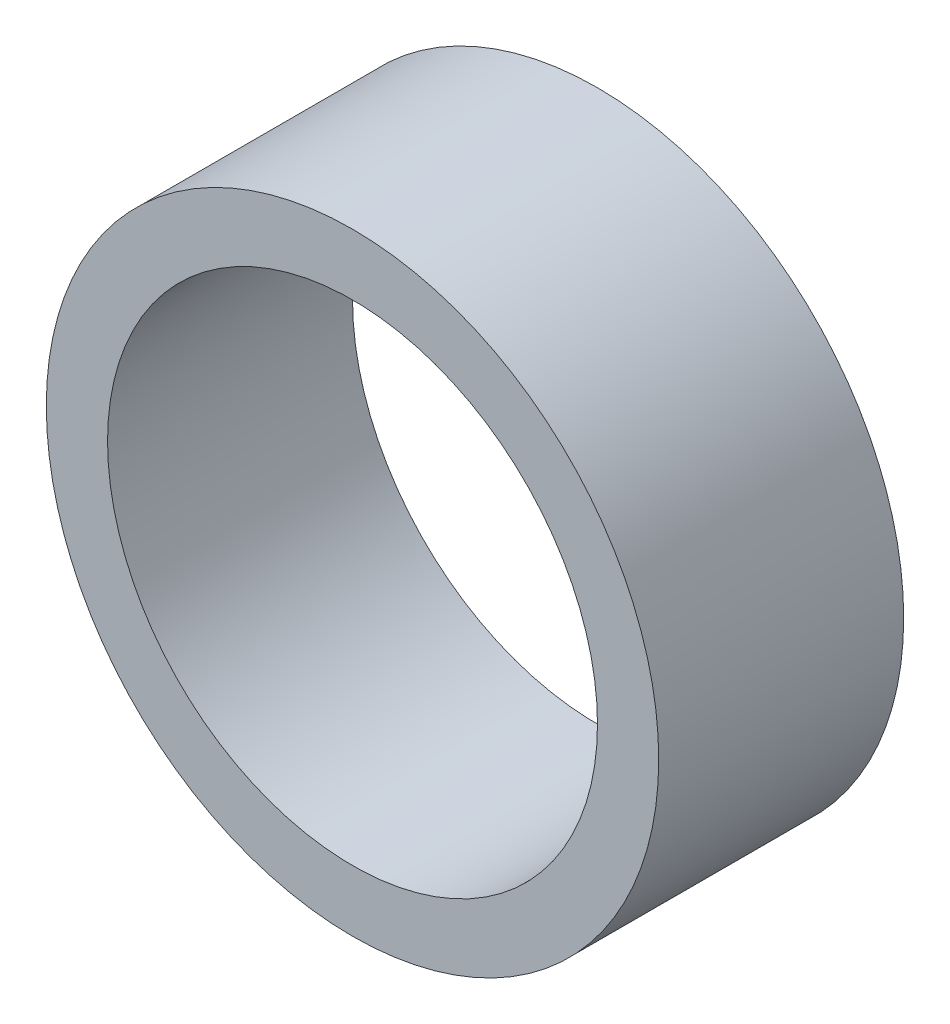
ISO-10303-21;
HEADER;
FILE_DESCRIPTION(('STEP AP214'),'2;1');
FILE_NAME('part.step','',(''),(''),'','','');
FILE_SCHEMA(('AUTOMOTIVE_DESIGN { 1 0 10303 214 1 1 1 1 }'));
ENDSEC;
DATA;
#1=APPLICATION_CONTEXT('core data for automotive mechanical design processes');
#2=APPLICATION_PROTOCOL_DEFINITION('international standard','automotive_design',2000,#1);
#3=PRODUCT_CONTEXT('',#1,'mechanical');
#4=PRODUCT('Part','Part','',(#3));
#5=PRODUCT_RELATED_PRODUCT_CATEGORY('part','',(#4));
#6=PRODUCT_DEFINITION_FORMATION('','',#4);
#7=PRODUCT_DEFINITION_CONTEXT('part definition',#1,'design');
#8=PRODUCT_DEFINITION('design','',#6,#7);
#9=PRODUCT_DEFINITION_SHAPE('','',#8);
#10=(LENGTH_UNIT() NAMED_UNIT(*) SI_UNIT(.MILLI.,.METRE.));
#11=(NAMED_UNIT(*) PLANE_ANGLE_UNIT() SI_UNIT($,.RADIAN.));
#12=(NAMED_UNIT(*) SI_UNIT($,.STERADIAN.) SOLID_ANGLE_UNIT());
#13=UNCERTAINTY_MEASURE_WITH_UNIT(LENGTH_MEASURE(1.E-05),#10,'distance_accuracy_value','');
#14=(GEOMETRIC_REPRESENTATION_CONTEXT(3) GLOBAL_UNCERTAINTY_ASSIGNED_CONTEXT((#13)) GLOBAL_UNIT_ASSIGNED_CONTEXT((#10,
#11,#12)) REPRESENTATION_CONTEXT('',''));
#15=CARTESIAN_POINT('',(0.,0.,0.));
#16=DIRECTION('',(0.,0.,1.));
#17=DIRECTION('',(1.,0.,0.));
#18=AXIS2_PLACEMENT_3D('',#15,#16,#17);
#19=CARTESIAN_POINT('',(0.,0.,5.));
#20=DIRECTION('',(0.,0.,1.));
#21=DIRECTION('',(1.,0.,0.));
#22=AXIS2_PLACEMENT_3D('',#19,#20,#21);
#23=PLANE('',#22);
#24=CARTESIAN_POINT('',(0.,0.,5.));
#25=DIRECTION('',(0.,0.,1.));
#26=DIRECTION('',(1.,0.,0.));
#27=AXIS2_PLACEMENT_3D('',#24,#25,#26);
#28=CIRCLE('',#27,6.25);
#29=CARTESIAN_POINT('',(6.25,0.,5.));
#30=VERTEX_POINT('',#29);
#31=EDGE_CURVE('E10',#30,#30,#28,.T.);
#32=ORIENTED_EDGE('',*,*,#31,.T.);
#33=EDGE_LOOP('',(#32));
#34=FACE_BOUND('',#33,.T.);
#35=CARTESIAN_POINT('',(0.,0.,5.));
#36=DIRECTION('',(0.,0.,1.));
#37=DIRECTION('',(1.,0.,0.));
#38=AXIS2_PLACEMENT_3D('',#35,#36,#37);
#39=CIRCLE('',#38,5.);
#40=CARTESIAN_POINT('',(5.,0.,5.));
#41=VERTEX_POINT('',#40);
#42=EDGE_CURVE('E48',#41,#41,#39,.T.);
#43=ORIENTED_EDGE('',*,*,#42,.F.);
#44=EDGE_LOOP('',(#43));
#45=FACE_BOUND('',#44,.T.);
#46=ADVANCED_FACE('F37',(#34,#45),#23,.T.);
#47=CARTESIAN_POINT('',(0.,0.,0.));
#48=DIRECTION('',(0.,0.,1.));
#49=DIRECTION('',(1.,0.,0.));
#50=AXIS2_PLACEMENT_3D('',#47,#48,#49);
#51=PLANE('',#50);
#52=CARTESIAN_POINT('',(0.,0.,0.));
#53=DIRECTION('',(0.,0.,1.));
#54=DIRECTION('',(1.,0.,0.));
#55=AXIS2_PLACEMENT_3D('',#52,#53,#54);
#56=CIRCLE('',#55,6.25);
#57=CARTESIAN_POINT('',(6.25,0.,0.));
#58=VERTEX_POINT('',#57);
#59=EDGE_CURVE('E41',#58,#58,#56,.T.);
#60=ORIENTED_EDGE('',*,*,#59,.F.);
#61=EDGE_LOOP('',(#60));
#62=FACE_BOUND('',#61,.T.);
#63=CARTESIAN_POINT('',(0.,0.,0.));
#64=DIRECTION('',(0.,0.,1.));
#65=DIRECTION('',(1.,0.,0.));
#66=AXIS2_PLACEMENT_3D('',#63,#64,#65);
#67=CIRCLE('',#66,5.);
#68=CARTESIAN_POINT('',(5.,0.,0.));
#69=VERTEX_POINT('',#68);
#70=EDGE_CURVE('E50',#69,#69,#67,.T.);
#71=ORIENTED_EDGE('',*,*,#70,.T.);
#72=EDGE_LOOP('',(#71));
#73=FACE_BOUND('',#72,.T.);
#74=ADVANCED_FACE('F60',(#62,#73),#51,.F.);
#75=CARTESIAN_POINT('',(0.,0.,5.));
#76=DIRECTION('',(0.,0.,-1.));
#77=DIRECTION('',(-1.,0.,0.));
#78=AXIS2_PLACEMENT_3D('',#75,#76,#77);
#79=CYLINDRICAL_SURFACE('',#78,6.25);
#80=ORIENTED_EDGE('',*,*,#31,.F.);
#81=EDGE_LOOP('',(#80));
#82=FACE_BOUND('',#81,.T.);
#83=ORIENTED_EDGE('',*,*,#59,.T.);
#84=EDGE_LOOP('',(#83));
#85=FACE_BOUND('',#84,.T.);
#86=ADVANCED_FACE('F39',(#82,#85),#79,.T.);
#87=CARTESIAN_POINT('',(0.,0.,5.));
#88=DIRECTION('',(0.,0.,-1.));
#89=DIRECTION('',(-1.,0.,0.));
#90=AXIS2_PLACEMENT_3D('',#87,#88,#89);
#91=CYLINDRICAL_SURFACE('',#90,5.);
#92=ORIENTED_EDGE('',*,*,#42,.T.);
#93=EDGE_LOOP('',(#92));
#94=FACE_BOUND('',#93,.T.);
#95=ORIENTED_EDGE('',*,*,#70,.F.);
#96=EDGE_LOOP('',(#95));
#97=FACE_BOUND('',#96,.T.);
#98=ADVANCED_FACE('F56',(#94,#97),#91,.F.);
#99=CLOSED_SHELL('',(#46,#74,#86,#98));
#100=MANIFOLD_SOLID_BREP('B2',#99);
#101=ADVANCED_BREP_SHAPE_REPRESENTATION('',(#18,#100),#14);
#102=SHAPE_DEFINITION_REPRESENTATION(#9,#101);
ENDSEC;
END-ISO-10303-21;
